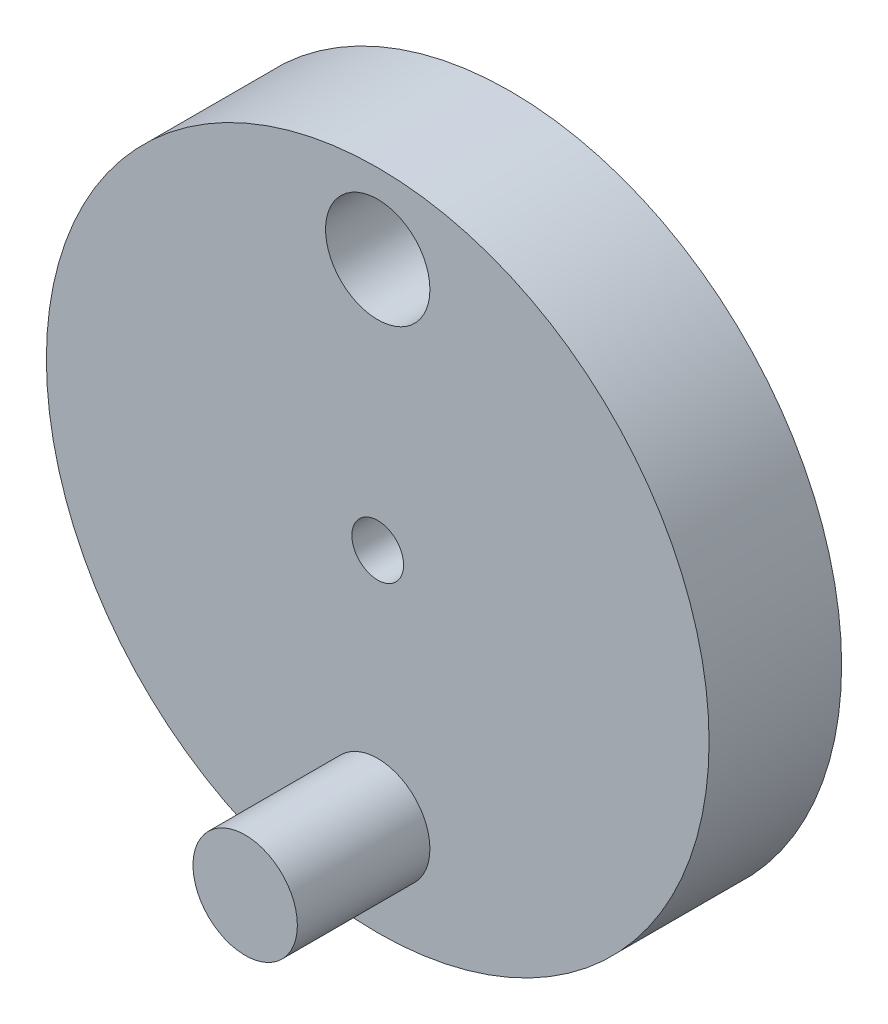
ISO-10303-21;
HEADER;
FILE_DESCRIPTION(('STEP AP214'),'2;1');
FILE_NAME('part.step','',(''),(''),'','','');
FILE_SCHEMA(('AUTOMOTIVE_DESIGN { 1 0 10303 214 1 1 1 1 }'));
ENDSEC;
DATA;
#1=APPLICATION_CONTEXT('core data for automotive mechanical design processes');
#2=APPLICATION_PROTOCOL_DEFINITION('international standard','automotive_design',2000,#1);
#3=PRODUCT_CONTEXT('',#1,'mechanical');
#4=PRODUCT('Part','Part','',(#3));
#5=PRODUCT_RELATED_PRODUCT_CATEGORY('part','',(#4));
#6=PRODUCT_DEFINITION_FORMATION('','',#4);
#7=PRODUCT_DEFINITION_CONTEXT('part definition',#1,'design');
#8=PRODUCT_DEFINITION('design','',#6,#7);
#9=PRODUCT_DEFINITION_SHAPE('','',#8);
#10=(LENGTH_UNIT() NAMED_UNIT(*) SI_UNIT(.MILLI.,.METRE.));
#11=(NAMED_UNIT(*) PLANE_ANGLE_UNIT() SI_UNIT($,.RADIAN.));
#12=(NAMED_UNIT(*) SI_UNIT($,.STERADIAN.) SOLID_ANGLE_UNIT());
#13=UNCERTAINTY_MEASURE_WITH_UNIT(LENGTH_MEASURE(1.E-05),#10,'distance_accuracy_value','');
#14=(GEOMETRIC_REPRESENTATION_CONTEXT(3) GLOBAL_UNCERTAINTY_ASSIGNED_CONTEXT((#13)) GLOBAL_UNIT_ASSIGNED_CONTEXT((#10,
#11,#12)) REPRESENTATION_CONTEXT('',''));
#15=CARTESIAN_POINT('',(0.,0.,0.));
#16=DIRECTION('',(0.,0.,1.));
#17=DIRECTION('',(1.,0.,0.));
#18=AXIS2_PLACEMENT_3D('',#15,#16,#17);
#19=CARTESIAN_POINT('',(0.,0.,5.08));
#20=DIRECTION('',(0.,0.,1.));
#21=DIRECTION('',(1.,0.,0.));
#22=AXIS2_PLACEMENT_3D('',#19,#20,#21);
#23=PLANE('',#22);
#24=CARTESIAN_POINT('',(0.,0.,5.08));
#25=DIRECTION('',(0.,0.,1.));
#26=DIRECTION('',(1.,0.,0.));
#27=AXIS2_PLACEMENT_3D('',#24,#25,#26);
#28=CIRCLE('',#27,12.7);
#29=CARTESIAN_POINT('',(12.7,0.,5.08));
#30=VERTEX_POINT('',#29);
#31=EDGE_CURVE('E10',#30,#30,#28,.T.);
#32=ORIENTED_EDGE('',*,*,#31,.T.);
#33=EDGE_LOOP('',(#32));
#34=FACE_BOUND('',#33,.T.);
#35=CARTESIAN_POINT('',(0.,0.,5.08));
#36=DIRECTION('',(0.,0.,1.));
#37=DIRECTION('',(1.,0.,0.));
#38=AXIS2_PLACEMENT_3D('',#35,#36,#37);
#39=CIRCLE('',#38,0.990599999999999);
#40=CARTESIAN_POINT('',(0.990599999999999,0.,5.08));
#41=VERTEX_POINT('',#40);
#42=EDGE_CURVE('E44',#41,#41,#39,.T.);
#43=ORIENTED_EDGE('',*,*,#42,.F.);
#44=EDGE_LOOP('',(#43));
#45=FACE_BOUND('',#44,.T.);
#46=CARTESIAN_POINT('',(0.,9.652,5.08));
#47=DIRECTION('',(0.,0.,1.));
#48=DIRECTION('',(1.,0.,0.));
#49=AXIS2_PLACEMENT_3D('',#46,#47,#48);
#50=CIRCLE('',#49,2.);
#51=CARTESIAN_POINT('',(2.,9.652,5.08));
#52=VERTEX_POINT('',#51);
#53=EDGE_CURVE('E50',#52,#52,#50,.T.);
#54=ORIENTED_EDGE('',*,*,#53,.F.);
#55=EDGE_LOOP('',(#54));
#56=FACE_BOUND('',#55,.T.);
#57=CARTESIAN_POINT('',(0.,-8.90922101095271,5.08));
#58=DIRECTION('',(0.,0.,1.));
#59=DIRECTION('',(1.,0.,0.));
#60=AXIS2_PLACEMENT_3D('',#57,#58,#59);
#61=CIRCLE('',#60,2.);
#62=CARTESIAN_POINT('',(2.,-8.90922101095271,5.08));
#63=VERTEX_POINT('',#62);
#64=EDGE_CURVE('E56',#63,#63,#61,.T.);
#65=ORIENTED_EDGE('',*,*,#64,.F.);
#66=EDGE_LOOP('',(#65));
#67=FACE_BOUND('',#66,.T.);
#68=ADVANCED_FACE('F31',(#34,#45,#56,#67),#23,.T.);
#69=CARTESIAN_POINT('',(0.,0.,5.08));
#70=DIRECTION('',(0.,0.,-1.));
#71=DIRECTION('',(-1.,0.,0.));
#72=AXIS2_PLACEMENT_3D('',#69,#70,#71);
#73=CYLINDRICAL_SURFACE('',#72,12.7);
#74=ORIENTED_EDGE('',*,*,#31,.F.);
#75=EDGE_LOOP('',(#74));
#76=FACE_BOUND('',#75,.T.);
#77=CARTESIAN_POINT('',(0.,0.,0.));
#78=DIRECTION('',(0.,0.,1.));
#79=DIRECTION('',(1.,0.,0.));
#80=AXIS2_PLACEMENT_3D('',#77,#78,#79);
#81=CIRCLE('',#80,12.7);
#82=CARTESIAN_POINT('',(12.7,0.,0.));
#83=VERTEX_POINT('',#82);
#84=EDGE_CURVE('E35',#83,#83,#81,.T.);
#85=ORIENTED_EDGE('',*,*,#84,.T.);
#86=EDGE_LOOP('',(#85));
#87=FACE_BOUND('',#86,.T.);
#88=ADVANCED_FACE('F33',(#76,#87),#73,.T.);
#89=CARTESIAN_POINT('',(0.,0.,0.));
#90=DIRECTION('',(0.,0.,1.));
#91=DIRECTION('',(1.,0.,0.));
#92=AXIS2_PLACEMENT_3D('',#89,#90,#91);
#93=PLANE('',#92);
#94=CARTESIAN_POINT('',(0.,9.652,0.));
#95=DIRECTION('',(0.,0.,1.));
#96=DIRECTION('',(1.,0.,0.));
#97=AXIS2_PLACEMENT_3D('',#94,#95,#96);
#98=CIRCLE('',#97,2.);
#99=CARTESIAN_POINT('',(2.,9.652,0.));
#100=VERTEX_POINT('',#99);
#101=EDGE_CURVE('E47',#100,#100,#98,.T.);
#102=ORIENTED_EDGE('',*,*,#101,.T.);
#103=EDGE_LOOP('',(#102));
#104=FACE_BOUND('',#103,.T.);
#105=CARTESIAN_POINT('',(0.,0.,0.));
#106=DIRECTION('',(0.,0.,1.));
#107=DIRECTION('',(1.,0.,0.));
#108=AXIS2_PLACEMENT_3D('',#105,#106,#107);
#109=CIRCLE('',#108,0.990599999999999);
#110=CARTESIAN_POINT('',(0.990599999999999,0.,0.));
#111=VERTEX_POINT('',#110);
#112=EDGE_CURVE('E42',#111,#111,#109,.T.);
#113=ORIENTED_EDGE('',*,*,#112,.T.);
#114=EDGE_LOOP('',(#113));
#115=FACE_BOUND('',#114,.T.);
#116=ORIENTED_EDGE('',*,*,#84,.F.);
#117=EDGE_LOOP('',(#116));
#118=FACE_BOUND('',#117,.T.);
#119=ADVANCED_FACE('F78',(#104,#115,#118),#93,.F.);
#120=CARTESIAN_POINT('',(0.,0.,0.));
#121=DIRECTION('',(0.,0.,1.));
#122=DIRECTION('',(1.,0.,0.));
#123=AXIS2_PLACEMENT_3D('',#120,#121,#122);
#124=CYLINDRICAL_SURFACE('',#123,0.990599999999999);
#125=ORIENTED_EDGE('',*,*,#112,.F.);
#126=EDGE_LOOP('',(#125));
#127=FACE_BOUND('',#126,.T.);
#128=ORIENTED_EDGE('',*,*,#42,.T.);
#129=EDGE_LOOP('',(#128));
#130=FACE_BOUND('',#129,.T.);
#131=ADVANCED_FACE('F82',(#127,#130),#124,.F.);
#132=CARTESIAN_POINT('',(0.,9.652,0.));
#133=DIRECTION('',(0.,0.,1.));
#134=DIRECTION('',(1.,0.,0.));
#135=AXIS2_PLACEMENT_3D('',#132,#133,#134);
#136=CYLINDRICAL_SURFACE('',#135,2.);
#137=ORIENTED_EDGE('',*,*,#101,.F.);
#138=EDGE_LOOP('',(#137));
#139=FACE_BOUND('',#138,.T.);
#140=ORIENTED_EDGE('',*,*,#53,.T.);
#141=EDGE_LOOP('',(#140));
#142=FACE_BOUND('',#141,.T.);
#143=ADVANCED_FACE('F67',(#139,#142),#136,.F.);
#144=CARTESIAN_POINT('',(0.,-8.90922101095271,10.16));
#145=DIRECTION('',(0.,0.,-1.));
#146=DIRECTION('',(-1.,0.,0.));
#147=AXIS2_PLACEMENT_3D('',#144,#145,#146);
#148=CYLINDRICAL_SURFACE('',#147,2.);
#149=CARTESIAN_POINT('',(0.,-8.90922101095271,10.16));
#150=DIRECTION('',(0.,0.,1.));
#151=DIRECTION('',(1.,0.,0.));
#152=AXIS2_PLACEMENT_3D('',#149,#150,#151);
#153=CIRCLE('',#152,2.);
#154=CARTESIAN_POINT('',(2.,-8.90922101095271,10.16));
#155=VERTEX_POINT('',#154);
#156=EDGE_CURVE('E53',#155,#155,#153,.T.);
#157=ORIENTED_EDGE('',*,*,#156,.F.);
#158=EDGE_LOOP('',(#157));
#159=FACE_BOUND('',#158,.T.);
#160=ORIENTED_EDGE('',*,*,#64,.T.);
#161=EDGE_LOOP('',(#160));
#162=FACE_BOUND('',#161,.T.);
#163=ADVANCED_FACE('F64',(#159,#162),#148,.T.);
#164=CARTESIAN_POINT('',(0.,-8.90922101095271,10.16));
#165=DIRECTION('',(0.,0.,1.));
#166=DIRECTION('',(1.,0.,0.));
#167=AXIS2_PLACEMENT_3D('',#164,#165,#166);
#168=PLANE('',#167);
#169=ORIENTED_EDGE('',*,*,#156,.T.);
#170=EDGE_LOOP('',(#169));
#171=FACE_BOUND('',#170,.T.);
#172=ADVANCED_FACE('F62',(#171),#168,.T.);
#173=CLOSED_SHELL('',(#68,#88,#119,#131,#143,#163,#172));
#174=MANIFOLD_SOLID_BREP('B2',#173);
#175=ADVANCED_BREP_SHAPE_REPRESENTATION('',(#18,#174),#14);
#176=SHAPE_DEFINITION_REPRESENTATION(#9,#175);
ENDSEC;
END-ISO-10303-21;
